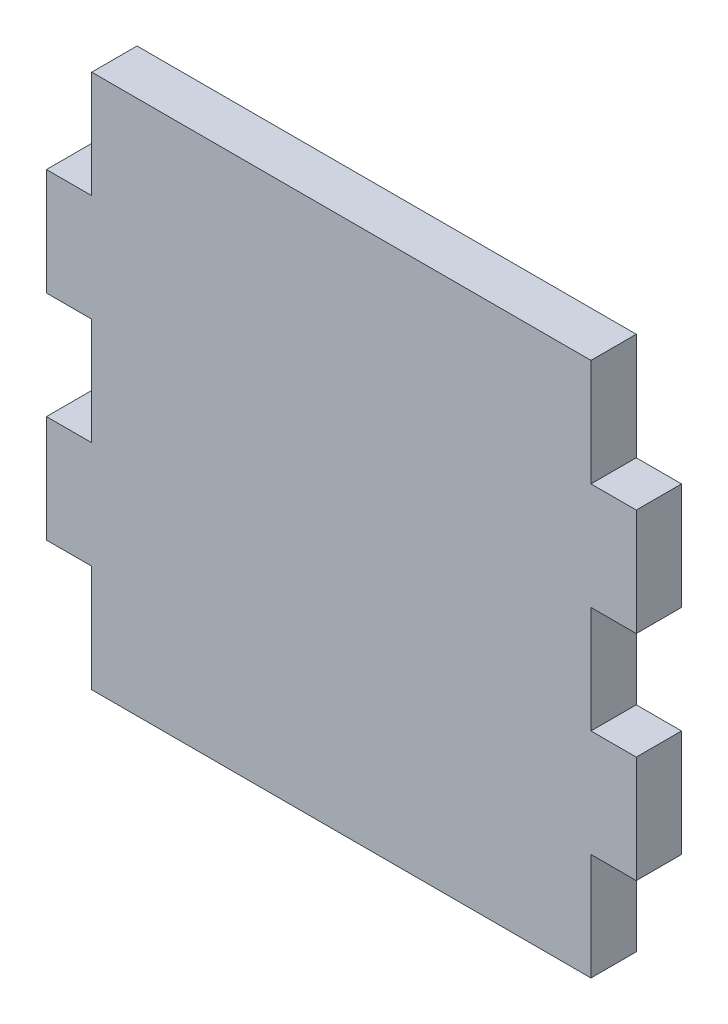
ISO-10303-21;
HEADER;
FILE_DESCRIPTION(('STEP AP214'),'2;1');
FILE_NAME('part.step','',(''),(''),'','','');
FILE_SCHEMA(('AUTOMOTIVE_DESIGN { 1 0 10303 214 1 1 1 1 }'));
ENDSEC;
DATA;
#1=APPLICATION_CONTEXT('core data for automotive mechanical design processes');
#2=APPLICATION_PROTOCOL_DEFINITION('international standard','automotive_design',2000,#1);
#3=PRODUCT_CONTEXT('',#1,'mechanical');
#4=PRODUCT('Part','Part','',(#3));
#5=PRODUCT_RELATED_PRODUCT_CATEGORY('part','',(#4));
#6=PRODUCT_DEFINITION_FORMATION('','',#4);
#7=PRODUCT_DEFINITION_CONTEXT('part definition',#1,'design');
#8=PRODUCT_DEFINITION('design','',#6,#7);
#9=PRODUCT_DEFINITION_SHAPE('','',#8);
#10=(LENGTH_UNIT() NAMED_UNIT(*) SI_UNIT(.MILLI.,.METRE.));
#11=(NAMED_UNIT(*) PLANE_ANGLE_UNIT() SI_UNIT($,.RADIAN.));
#12=(NAMED_UNIT(*) SI_UNIT($,.STERADIAN.) SOLID_ANGLE_UNIT());
#13=UNCERTAINTY_MEASURE_WITH_UNIT(LENGTH_MEASURE(1.E-05),#10,'distance_accuracy_value','');
#14=(GEOMETRIC_REPRESENTATION_CONTEXT(3) GLOBAL_UNCERTAINTY_ASSIGNED_CONTEXT((#13)) GLOBAL_UNIT_ASSIGNED_CONTEXT((#10,
#11,#12)) REPRESENTATION_CONTEXT('',''));
#15=CARTESIAN_POINT('',(0.,0.,0.));
#16=DIRECTION('',(0.,0.,1.));
#17=DIRECTION('',(1.,0.,0.));
#18=AXIS2_PLACEMENT_3D('',#15,#16,#17);
#19=CARTESIAN_POINT('',(0.,15.,6.35));
#20=DIRECTION('',(-1.,0.,0.));
#21=DIRECTION('',(0.,0.,1.));
#22=AXIS2_PLACEMENT_3D('',#19,#20,#21);
#23=PLANE('',#22);
#24=DIRECTION('',(0.,1.,0.));
#25=VECTOR('',#24,1.);
#26=CARTESIAN_POINT('',(0.,15.,0.));
#27=LINE('',#26,#25);
#28=CARTESIAN_POINT('',(0.,0.,0.));
#29=VERTEX_POINT('',#28);
#30=CARTESIAN_POINT('',(0.,15.,0.));
#31=VERTEX_POINT('',#30);
#32=EDGE_CURVE('E199',#29,#31,#27,.T.);
#33=ORIENTED_EDGE('',*,*,#32,.T.);
#34=DIRECTION('',(0.,0.,-1.));
#35=VECTOR('',#34,1.);
#36=CARTESIAN_POINT('',(0.,15.,6.35));
#37=LINE('',#36,#35);
#38=CARTESIAN_POINT('',(0.,15.,6.35));
#39=VERTEX_POINT('',#38);
#40=EDGE_CURVE('E11',#39,#31,#37,.T.);
#41=ORIENTED_EDGE('',*,*,#40,.F.);
#42=DIRECTION('',(0.,1.,0.));
#43=VECTOR('',#42,1.);
#44=CARTESIAN_POINT('',(0.,15.,6.35));
#45=LINE('',#44,#43);
#46=CARTESIAN_POINT('',(0.,0.,6.35));
#47=VERTEX_POINT('',#46);
#48=EDGE_CURVE('E237',#47,#39,#45,.T.);
#49=ORIENTED_EDGE('',*,*,#48,.F.);
#50=DIRECTION('',(0.,0.,-1.));
#51=VECTOR('',#50,1.);
#52=CARTESIAN_POINT('',(0.,0.,6.35));
#53=LINE('',#52,#51);
#54=EDGE_CURVE('E195',#47,#29,#53,.T.);
#55=ORIENTED_EDGE('',*,*,#54,.T.);
#56=EDGE_LOOP('',(#33,#41,#49,#55));
#57=FACE_BOUND('',#56,.T.);
#58=ADVANCED_FACE('F31',(#57),#23,.F.);
#59=CARTESIAN_POINT('',(6.34999999999999,15.,6.35));
#60=DIRECTION('',(0.,1.,0.));
#61=DIRECTION('',(0.,0.,1.));
#62=AXIS2_PLACEMENT_3D('',#59,#60,#61);
#63=PLANE('',#62);
#64=DIRECTION('',(1.,0.,0.));
#65=VECTOR('',#64,1.);
#66=CARTESIAN_POINT('',(6.34999999999999,15.,0.));
#67=LINE('',#66,#65);
#68=CARTESIAN_POINT('',(6.34999999999999,15.,0.));
#69=VERTEX_POINT('',#68);
#70=EDGE_CURVE('E202',#31,#69,#67,.T.);
#71=ORIENTED_EDGE('',*,*,#70,.T.);
#72=DIRECTION('',(0.,0.,-1.));
#73=VECTOR('',#72,1.);
#74=CARTESIAN_POINT('',(6.34999999999999,15.,6.35));
#75=LINE('',#74,#73);
#76=CARTESIAN_POINT('',(6.34999999999999,15.,6.35));
#77=VERTEX_POINT('',#76);
#78=EDGE_CURVE('E39',#77,#69,#75,.T.);
#79=ORIENTED_EDGE('',*,*,#78,.F.);
#80=DIRECTION('',(1.,0.,0.));
#81=VECTOR('',#80,1.);
#82=CARTESIAN_POINT('',(6.34999999999999,15.,6.35));
#83=LINE('',#82,#81);
#84=EDGE_CURVE('E126',#39,#77,#83,.T.);
#85=ORIENTED_EDGE('',*,*,#84,.F.);
#86=ORIENTED_EDGE('',*,*,#40,.T.);
#87=EDGE_LOOP('',(#71,#79,#85,#86));
#88=FACE_BOUND('',#87,.T.);
#89=ADVANCED_FACE('F355',(#88),#63,.F.);
#90=CARTESIAN_POINT('',(6.34999999999999,30.,6.35));
#91=DIRECTION('',(-1.,0.,0.));
#92=DIRECTION('',(0.,0.,1.));
#93=AXIS2_PLACEMENT_3D('',#90,#91,#92);
#94=PLANE('',#93);
#95=DIRECTION('',(0.,1.,0.));
#96=VECTOR('',#95,1.);
#97=CARTESIAN_POINT('',(6.34999999999999,30.,0.));
#98=LINE('',#97,#96);
#99=CARTESIAN_POINT('',(6.34999999999999,30.,0.));
#100=VERTEX_POINT('',#99);
#101=EDGE_CURVE('E204',#69,#100,#98,.T.);
#102=ORIENTED_EDGE('',*,*,#101,.T.);
#103=DIRECTION('',(0.,0.,-1.));
#104=VECTOR('',#103,1.);
#105=CARTESIAN_POINT('',(6.34999999999999,30.,6.35));
#106=LINE('',#105,#104);
#107=CARTESIAN_POINT('',(6.34999999999999,30.,6.35));
#108=VERTEX_POINT('',#107);
#109=EDGE_CURVE('E280',#108,#100,#106,.T.);
#110=ORIENTED_EDGE('',*,*,#109,.F.);
#111=DIRECTION('',(0.,1.,0.));
#112=VECTOR('',#111,1.);
#113=CARTESIAN_POINT('',(6.34999999999999,30.,6.35));
#114=LINE('',#113,#112);
#115=EDGE_CURVE('E288',#77,#108,#114,.T.);
#116=ORIENTED_EDGE('',*,*,#115,.F.);
#117=ORIENTED_EDGE('',*,*,#78,.T.);
#118=EDGE_LOOP('',(#102,#110,#116,#117));
#119=FACE_BOUND('',#118,.T.);
#120=ADVANCED_FACE('F286',(#119),#94,.F.);
#121=CARTESIAN_POINT('',(0.,30.,6.35));
#122=DIRECTION('',(0.,-1.,0.));
#123=DIRECTION('',(0.,0.,-1.));
#124=AXIS2_PLACEMENT_3D('',#121,#122,#123);
#125=PLANE('',#124);
#126=DIRECTION('',(-1.,0.,0.));
#127=VECTOR('',#126,1.);
#128=CARTESIAN_POINT('',(0.,30.,0.));
#129=LINE('',#128,#127);
#130=CARTESIAN_POINT('',(0.,30.,0.));
#131=VERTEX_POINT('',#130);
#132=EDGE_CURVE('E206',#100,#131,#129,.T.);
#133=ORIENTED_EDGE('',*,*,#132,.T.);
#134=DIRECTION('',(0.,0.,-1.));
#135=VECTOR('',#134,1.);
#136=CARTESIAN_POINT('',(0.,30.,6.35));
#137=LINE('',#136,#135);
#138=CARTESIAN_POINT('',(0.,30.,6.35));
#139=VERTEX_POINT('',#138);
#140=EDGE_CURVE('E277',#139,#131,#137,.T.);
#141=ORIENTED_EDGE('',*,*,#140,.F.);
#142=DIRECTION('',(-1.,0.,0.));
#143=VECTOR('',#142,1.);
#144=CARTESIAN_POINT('',(0.,30.,6.35));
#145=LINE('',#144,#143);
#146=EDGE_CURVE('E306',#108,#139,#145,.T.);
#147=ORIENTED_EDGE('',*,*,#146,.F.);
#148=ORIENTED_EDGE('',*,*,#109,.T.);
#149=EDGE_LOOP('',(#133,#141,#147,#148));
#150=FACE_BOUND('',#149,.T.);
#151=ADVANCED_FACE('F297',(#150),#125,.F.);
#152=CARTESIAN_POINT('',(0.,45.,6.35));
#153=DIRECTION('',(-1.,0.,0.));
#154=DIRECTION('',(0.,0.,1.));
#155=AXIS2_PLACEMENT_3D('',#152,#153,#154);
#156=PLANE('',#155);
#157=DIRECTION('',(0.,1.,0.));
#158=VECTOR('',#157,1.);
#159=CARTESIAN_POINT('',(0.,45.,0.));
#160=LINE('',#159,#158);
#161=CARTESIAN_POINT('',(0.,45.,0.));
#162=VERTEX_POINT('',#161);
#163=EDGE_CURVE('E208',#131,#162,#160,.T.);
#164=ORIENTED_EDGE('',*,*,#163,.T.);
#165=DIRECTION('',(0.,0.,-1.));
#166=VECTOR('',#165,1.);
#167=CARTESIAN_POINT('',(0.,45.,6.35));
#168=LINE('',#167,#166);
#169=CARTESIAN_POINT('',(0.,45.,6.35));
#170=VERTEX_POINT('',#169);
#171=EDGE_CURVE('E274',#170,#162,#168,.T.);
#172=ORIENTED_EDGE('',*,*,#171,.F.);
#173=DIRECTION('',(0.,1.,0.));
#174=VECTOR('',#173,1.);
#175=CARTESIAN_POINT('',(0.,45.,6.35));
#176=LINE('',#175,#174);
#177=EDGE_CURVE('E303',#139,#170,#176,.T.);
#178=ORIENTED_EDGE('',*,*,#177,.F.);
#179=ORIENTED_EDGE('',*,*,#140,.T.);
#180=EDGE_LOOP('',(#164,#172,#178,#179));
#181=FACE_BOUND('',#180,.T.);
#182=ADVANCED_FACE('F301',(#181),#156,.F.);
#183=CARTESIAN_POINT('',(6.34999999999999,45.,6.35));
#184=DIRECTION('',(0.,1.,0.));
#185=DIRECTION('',(0.,0.,1.));
#186=AXIS2_PLACEMENT_3D('',#183,#184,#185);
#187=PLANE('',#186);
#188=DIRECTION('',(1.,0.,0.));
#189=VECTOR('',#188,1.);
#190=CARTESIAN_POINT('',(6.34999999999999,45.,0.));
#191=LINE('',#190,#189);
#192=CARTESIAN_POINT('',(6.34999999999999,45.,0.));
#193=VERTEX_POINT('',#192);
#194=EDGE_CURVE('E210',#162,#193,#191,.T.);
#195=ORIENTED_EDGE('',*,*,#194,.T.);
#196=DIRECTION('',(0.,0.,-1.));
#197=VECTOR('',#196,1.);
#198=CARTESIAN_POINT('',(6.34999999999999,45.,6.35));
#199=LINE('',#198,#197);
#200=CARTESIAN_POINT('',(6.34999999999999,45.,6.35));
#201=VERTEX_POINT('',#200);
#202=EDGE_CURVE('E271',#201,#193,#199,.T.);
#203=ORIENTED_EDGE('',*,*,#202,.F.);
#204=DIRECTION('',(1.,0.,0.));
#205=VECTOR('',#204,1.);
#206=CARTESIAN_POINT('',(6.34999999999999,45.,6.35));
#207=LINE('',#206,#205);
#208=EDGE_CURVE('E305',#170,#201,#207,.T.);
#209=ORIENTED_EDGE('',*,*,#208,.F.);
#210=ORIENTED_EDGE('',*,*,#171,.T.);
#211=EDGE_LOOP('',(#195,#203,#209,#210));
#212=FACE_BOUND('',#211,.T.);
#213=ADVANCED_FACE('F368',(#212),#187,.F.);
#214=CARTESIAN_POINT('',(6.35000000000001,60.,6.35));
#215=DIRECTION('',(-1.,0.,0.));
#216=DIRECTION('',(0.,-1.,0.));
#217=AXIS2_PLACEMENT_3D('',#214,#215,#216);
#218=PLANE('',#217);
#219=DIRECTION('',(0.,1.,0.));
#220=VECTOR('',#219,1.);
#221=CARTESIAN_POINT('',(6.35000000000001,60.,0.));
#222=LINE('',#221,#220);
#223=CARTESIAN_POINT('',(6.35000000000001,60.,0.));
#224=VERTEX_POINT('',#223);
#225=EDGE_CURVE('E212',#193,#224,#222,.T.);
#226=ORIENTED_EDGE('',*,*,#225,.T.);
#227=DIRECTION('',(0.,0.,-1.));
#228=VECTOR('',#227,1.);
#229=CARTESIAN_POINT('',(6.35000000000001,60.,6.35));
#230=LINE('',#229,#228);
#231=CARTESIAN_POINT('',(6.35000000000001,60.,6.35));
#232=VERTEX_POINT('',#231);
#233=EDGE_CURVE('E268',#232,#224,#230,.T.);
#234=ORIENTED_EDGE('',*,*,#233,.F.);
#235=DIRECTION('',(0.,1.,0.));
#236=VECTOR('',#235,1.);
#237=CARTESIAN_POINT('',(6.35000000000001,60.,6.35));
#238=LINE('',#237,#236);
#239=EDGE_CURVE('E308',#201,#232,#238,.T.);
#240=ORIENTED_EDGE('',*,*,#239,.F.);
#241=ORIENTED_EDGE('',*,*,#202,.T.);
#242=EDGE_LOOP('',(#226,#234,#240,#241));
#243=FACE_BOUND('',#242,.T.);
#244=ADVANCED_FACE('F371',(#243),#218,.F.);
#245=CARTESIAN_POINT('',(0.,60.,6.35));
#246=DIRECTION('',(0.,-1.,0.));
#247=DIRECTION('',(0.,0.,-1.));
#248=AXIS2_PLACEMENT_3D('',#245,#246,#247);
#249=PLANE('',#248);
#250=DIRECTION('',(-1.,0.,0.));
#251=VECTOR('',#250,1.);
#252=CARTESIAN_POINT('',(0.,60.,0.));
#253=LINE('',#252,#251);
#254=CARTESIAN_POINT('',(0.,60.,0.));
#255=VERTEX_POINT('',#254);
#256=EDGE_CURVE('E214',#224,#255,#253,.T.);
#257=ORIENTED_EDGE('',*,*,#256,.T.);
#258=DIRECTION('',(0.,0.,-1.));
#259=VECTOR('',#258,1.);
#260=CARTESIAN_POINT('',(0.,60.,6.35));
#261=LINE('',#260,#259);
#262=CARTESIAN_POINT('',(0.,60.,6.35));
#263=VERTEX_POINT('',#262);
#264=EDGE_CURVE('E265',#263,#255,#261,.T.);
#265=ORIENTED_EDGE('',*,*,#264,.F.);
#266=DIRECTION('',(-1.,0.,0.));
#267=VECTOR('',#266,1.);
#268=CARTESIAN_POINT('',(0.,60.,6.35));
#269=LINE('',#268,#267);
#270=EDGE_CURVE('E314',#232,#263,#269,.T.);
#271=ORIENTED_EDGE('',*,*,#270,.F.);
#272=ORIENTED_EDGE('',*,*,#233,.T.);
#273=EDGE_LOOP('',(#257,#265,#271,#272));
#274=FACE_BOUND('',#273,.T.);
#275=ADVANCED_FACE('F375',(#274),#249,.F.);
#276=CARTESIAN_POINT('',(0.,75.,6.35));
#277=DIRECTION('',(-1.,0.,0.));
#278=DIRECTION('',(0.,0.,1.));
#279=AXIS2_PLACEMENT_3D('',#276,#277,#278);
#280=PLANE('',#279);
#281=DIRECTION('',(0.,1.,0.));
#282=VECTOR('',#281,1.);
#283=CARTESIAN_POINT('',(0.,75.,0.));
#284=LINE('',#283,#282);
#285=CARTESIAN_POINT('',(0.,75.,0.));
#286=VERTEX_POINT('',#285);
#287=EDGE_CURVE('E216',#255,#286,#284,.T.);
#288=ORIENTED_EDGE('',*,*,#287,.T.);
#289=DIRECTION('',(0.,0.,-1.));
#290=VECTOR('',#289,1.);
#291=CARTESIAN_POINT('',(0.,75.,6.35));
#292=LINE('',#291,#290);
#293=CARTESIAN_POINT('',(0.,75.,6.35));
#294=VERTEX_POINT('',#293);
#295=EDGE_CURVE('E262',#294,#286,#292,.T.);
#296=ORIENTED_EDGE('',*,*,#295,.F.);
#297=DIRECTION('',(0.,1.,0.));
#298=VECTOR('',#297,1.);
#299=CARTESIAN_POINT('',(0.,75.,6.35));
#300=LINE('',#299,#298);
#301=EDGE_CURVE('E316',#263,#294,#300,.T.);
#302=ORIENTED_EDGE('',*,*,#301,.F.);
#303=ORIENTED_EDGE('',*,*,#264,.T.);
#304=EDGE_LOOP('',(#288,#296,#302,#303));
#305=FACE_BOUND('',#304,.T.);
#306=ADVANCED_FACE('F379',(#305),#280,.F.);
#307=CARTESIAN_POINT('',(0.,75.,6.35));
#308=DIRECTION('',(0.,-1.,0.));
#309=DIRECTION('',(0.,0.,-1.));
#310=AXIS2_PLACEMENT_3D('',#307,#308,#309);
#311=PLANE('',#310);
#312=DIRECTION('',(-1.,0.,0.));
#313=VECTOR('',#312,1.);
#314=CARTESIAN_POINT('',(0.,75.,0.));
#315=LINE('',#314,#313);
#316=CARTESIAN_POINT('',(-70.,75.,0.));
#317=VERTEX_POINT('',#316);
#318=EDGE_CURVE('E218',#286,#317,#315,.T.);
#319=ORIENTED_EDGE('',*,*,#318,.T.);
#320=DIRECTION('',(0.,0.,-1.));
#321=VECTOR('',#320,1.);
#322=CARTESIAN_POINT('',(-70.,75.,6.35));
#323=LINE('',#322,#321);
#324=CARTESIAN_POINT('',(-70.,75.,6.35));
#325=VERTEX_POINT('',#324);
#326=EDGE_CURVE('E259',#325,#317,#323,.T.);
#327=ORIENTED_EDGE('',*,*,#326,.F.);
#328=DIRECTION('',(-1.,0.,0.));
#329=VECTOR('',#328,1.);
#330=CARTESIAN_POINT('',(0.,75.,6.35));
#331=LINE('',#330,#329);
#332=EDGE_CURVE('E318',#294,#325,#331,.T.);
#333=ORIENTED_EDGE('',*,*,#332,.F.);
#334=ORIENTED_EDGE('',*,*,#295,.T.);
#335=EDGE_LOOP('',(#319,#327,#333,#334));
#336=FACE_BOUND('',#335,.T.);
#337=ADVANCED_FACE('F383',(#336),#311,.F.);
#338=CARTESIAN_POINT('',(-70.,75.,6.35));
#339=DIRECTION('',(1.,0.,0.));
#340=DIRECTION('',(0.,0.,-1.));
#341=AXIS2_PLACEMENT_3D('',#338,#339,#340);
#342=PLANE('',#341);
#343=DIRECTION('',(0.,-1.,0.));
#344=VECTOR('',#343,1.);
#345=CARTESIAN_POINT('',(-70.,75.,0.));
#346=LINE('',#345,#344);
#347=CARTESIAN_POINT('',(-70.,60.,0.));
#348=VERTEX_POINT('',#347);
#349=EDGE_CURVE('E220',#317,#348,#346,.T.);
#350=ORIENTED_EDGE('',*,*,#349,.T.);
#351=DIRECTION('',(0.,0.,-1.));
#352=VECTOR('',#351,1.);
#353=CARTESIAN_POINT('',(-70.,60.,6.35));
#354=LINE('',#353,#352);
#355=CARTESIAN_POINT('',(-70.,60.,6.35));
#356=VERTEX_POINT('',#355);
#357=EDGE_CURVE('E256',#356,#348,#354,.T.);
#358=ORIENTED_EDGE('',*,*,#357,.F.);
#359=DIRECTION('',(0.,-1.,0.));
#360=VECTOR('',#359,1.);
#361=CARTESIAN_POINT('',(-70.,75.,6.35));
#362=LINE('',#361,#360);
#363=EDGE_CURVE('E320',#325,#356,#362,.T.);
#364=ORIENTED_EDGE('',*,*,#363,.F.);
#365=ORIENTED_EDGE('',*,*,#326,.T.);
#366=EDGE_LOOP('',(#350,#358,#364,#365));
#367=FACE_BOUND('',#366,.T.);
#368=ADVANCED_FACE('F387',(#367),#342,.F.);
#369=CARTESIAN_POINT('',(-70.,60.,6.35));
#370=DIRECTION('',(0.,-1.,0.));
#371=DIRECTION('',(0.,0.,-1.));
#372=AXIS2_PLACEMENT_3D('',#369,#370,#371);
#373=PLANE('',#372);
#374=DIRECTION('',(-1.,0.,0.));
#375=VECTOR('',#374,1.);
#376=CARTESIAN_POINT('',(-70.,60.,0.));
#377=LINE('',#376,#375);
#378=CARTESIAN_POINT('',(-76.35,60.,0.));
#379=VERTEX_POINT('',#378);
#380=EDGE_CURVE('E222',#348,#379,#377,.T.);
#381=ORIENTED_EDGE('',*,*,#380,.T.);
#382=DIRECTION('',(0.,0.,-1.));
#383=VECTOR('',#382,1.);
#384=CARTESIAN_POINT('',(-76.35,60.,6.35));
#385=LINE('',#384,#383);
#386=CARTESIAN_POINT('',(-76.35,60.,6.35));
#387=VERTEX_POINT('',#386);
#388=EDGE_CURVE('E253',#387,#379,#385,.T.);
#389=ORIENTED_EDGE('',*,*,#388,.F.);
#390=DIRECTION('',(-1.,0.,0.));
#391=VECTOR('',#390,1.);
#392=CARTESIAN_POINT('',(-70.,60.,6.35));
#393=LINE('',#392,#391);
#394=EDGE_CURVE('E322',#356,#387,#393,.T.);
#395=ORIENTED_EDGE('',*,*,#394,.F.);
#396=ORIENTED_EDGE('',*,*,#357,.T.);
#397=EDGE_LOOP('',(#381,#389,#395,#396));
#398=FACE_BOUND('',#397,.T.);
#399=ADVANCED_FACE('F391',(#398),#373,.F.);
#400=CARTESIAN_POINT('',(-76.35,60.,6.35));
#401=DIRECTION('',(1.,0.,0.));
#402=DIRECTION('',(0.,0.,-1.));
#403=AXIS2_PLACEMENT_3D('',#400,#401,#402);
#404=PLANE('',#403);
#405=DIRECTION('',(0.,-1.,0.));
#406=VECTOR('',#405,1.);
#407=CARTESIAN_POINT('',(-76.35,60.,0.));
#408=LINE('',#407,#406);
#409=CARTESIAN_POINT('',(-76.35,45.,0.));
#410=VERTEX_POINT('',#409);
#411=EDGE_CURVE('E224',#379,#410,#408,.T.);
#412=ORIENTED_EDGE('',*,*,#411,.T.);
#413=DIRECTION('',(0.,0.,-1.));
#414=VECTOR('',#413,1.);
#415=CARTESIAN_POINT('',(-76.35,45.,6.35));
#416=LINE('',#415,#414);
#417=CARTESIAN_POINT('',(-76.35,45.,6.35));
#418=VERTEX_POINT('',#417);
#419=EDGE_CURVE('E250',#418,#410,#416,.T.);
#420=ORIENTED_EDGE('',*,*,#419,.F.);
#421=DIRECTION('',(0.,-1.,0.));
#422=VECTOR('',#421,1.);
#423=CARTESIAN_POINT('',(-76.35,60.,6.35));
#424=LINE('',#423,#422);
#425=EDGE_CURVE('E324',#387,#418,#424,.T.);
#426=ORIENTED_EDGE('',*,*,#425,.F.);
#427=ORIENTED_EDGE('',*,*,#388,.T.);
#428=EDGE_LOOP('',(#412,#420,#426,#427));
#429=FACE_BOUND('',#428,.T.);
#430=ADVANCED_FACE('F395',(#429),#404,.F.);
#431=CARTESIAN_POINT('',(-76.35,45.,6.35));
#432=DIRECTION('',(0.,1.,0.));
#433=DIRECTION('',(0.,0.,1.));
#434=AXIS2_PLACEMENT_3D('',#431,#432,#433);
#435=PLANE('',#434);
#436=DIRECTION('',(1.,0.,0.));
#437=VECTOR('',#436,1.);
#438=CARTESIAN_POINT('',(-76.35,45.,0.));
#439=LINE('',#438,#437);
#440=CARTESIAN_POINT('',(-70.,45.,0.));
#441=VERTEX_POINT('',#440);
#442=EDGE_CURVE('E226',#410,#441,#439,.T.);
#443=ORIENTED_EDGE('',*,*,#442,.T.);
#444=DIRECTION('',(0.,0.,-1.));
#445=VECTOR('',#444,1.);
#446=CARTESIAN_POINT('',(-70.,45.,6.35));
#447=LINE('',#446,#445);
#448=CARTESIAN_POINT('',(-70.,45.,6.35));
#449=VERTEX_POINT('',#448);
#450=EDGE_CURVE('E247',#449,#441,#447,.T.);
#451=ORIENTED_EDGE('',*,*,#450,.F.);
#452=DIRECTION('',(1.,0.,0.));
#453=VECTOR('',#452,1.);
#454=CARTESIAN_POINT('',(-76.35,45.,6.35));
#455=LINE('',#454,#453);
#456=EDGE_CURVE('E326',#418,#449,#455,.T.);
#457=ORIENTED_EDGE('',*,*,#456,.F.);
#458=ORIENTED_EDGE('',*,*,#419,.T.);
#459=EDGE_LOOP('',(#443,#451,#457,#458));
#460=FACE_BOUND('',#459,.T.);
#461=ADVANCED_FACE('F399',(#460),#435,.F.);
#462=CARTESIAN_POINT('',(-70.,45.,6.35));
#463=DIRECTION('',(1.,0.,0.));
#464=DIRECTION('',(0.,0.,-1.));
#465=AXIS2_PLACEMENT_3D('',#462,#463,#464);
#466=PLANE('',#465);
#467=DIRECTION('',(0.,-1.,0.));
#468=VECTOR('',#467,1.);
#469=CARTESIAN_POINT('',(-70.,45.,0.));
#470=LINE('',#469,#468);
#471=CARTESIAN_POINT('',(-70.,30.,0.));
#472=VERTEX_POINT('',#471);
#473=EDGE_CURVE('E228',#441,#472,#470,.T.);
#474=ORIENTED_EDGE('',*,*,#473,.T.);
#475=DIRECTION('',(0.,0.,-1.));
#476=VECTOR('',#475,1.);
#477=CARTESIAN_POINT('',(-70.,30.,6.35));
#478=LINE('',#477,#476);
#479=CARTESIAN_POINT('',(-70.,30.,6.35));
#480=VERTEX_POINT('',#479);
#481=EDGE_CURVE('E244',#480,#472,#478,.T.);
#482=ORIENTED_EDGE('',*,*,#481,.F.);
#483=DIRECTION('',(0.,-1.,0.));
#484=VECTOR('',#483,1.);
#485=CARTESIAN_POINT('',(-70.,45.,6.35));
#486=LINE('',#485,#484);
#487=EDGE_CURVE('E328',#449,#480,#486,.T.);
#488=ORIENTED_EDGE('',*,*,#487,.F.);
#489=ORIENTED_EDGE('',*,*,#450,.T.);
#490=EDGE_LOOP('',(#474,#482,#488,#489));
#491=FACE_BOUND('',#490,.T.);
#492=ADVANCED_FACE('F403',(#491),#466,.F.);
#493=CARTESIAN_POINT('',(-70.,30.,6.35));
#494=DIRECTION('',(0.,-1.,0.));
#495=DIRECTION('',(0.,0.,-1.));
#496=AXIS2_PLACEMENT_3D('',#493,#494,#495);
#497=PLANE('',#496);
#498=DIRECTION('',(-1.,0.,0.));
#499=VECTOR('',#498,1.);
#500=CARTESIAN_POINT('',(-70.,30.,0.));
#501=LINE('',#500,#499);
#502=CARTESIAN_POINT('',(-76.35,30.,0.));
#503=VERTEX_POINT('',#502);
#504=EDGE_CURVE('E230',#472,#503,#501,.T.);
#505=ORIENTED_EDGE('',*,*,#504,.T.);
#506=DIRECTION('',(0.,0.,-1.));
#507=VECTOR('',#506,1.);
#508=CARTESIAN_POINT('',(-76.35,30.,6.35));
#509=LINE('',#508,#507);
#510=CARTESIAN_POINT('',(-76.35,30.,6.35));
#511=VERTEX_POINT('',#510);
#512=EDGE_CURVE('E241',#511,#503,#509,.T.);
#513=ORIENTED_EDGE('',*,*,#512,.F.);
#514=DIRECTION('',(-1.,0.,0.));
#515=VECTOR('',#514,1.);
#516=CARTESIAN_POINT('',(-70.,30.,6.35));
#517=LINE('',#516,#515);
#518=EDGE_CURVE('E330',#480,#511,#517,.T.);
#519=ORIENTED_EDGE('',*,*,#518,.F.);
#520=ORIENTED_EDGE('',*,*,#481,.T.);
#521=EDGE_LOOP('',(#505,#513,#519,#520));
#522=FACE_BOUND('',#521,.T.);
#523=ADVANCED_FACE('F336',(#522),#497,.F.);
#524=CARTESIAN_POINT('',(-76.35,30.,6.35));
#525=DIRECTION('',(1.,0.,0.));
#526=DIRECTION('',(0.,0.,-1.));
#527=AXIS2_PLACEMENT_3D('',#524,#525,#526);
#528=PLANE('',#527);
#529=DIRECTION('',(0.,-1.,0.));
#530=VECTOR('',#529,1.);
#531=CARTESIAN_POINT('',(-76.35,30.,0.));
#532=LINE('',#531,#530);
#533=CARTESIAN_POINT('',(-76.35,15.,0.));
#534=VERTEX_POINT('',#533);
#535=EDGE_CURVE('E232',#503,#534,#532,.T.);
#536=ORIENTED_EDGE('',*,*,#535,.T.);
#537=DIRECTION('',(0.,0.,-1.));
#538=VECTOR('',#537,1.);
#539=CARTESIAN_POINT('',(-76.35,15.,6.35));
#540=LINE('',#539,#538);
#541=CARTESIAN_POINT('',(-76.35,15.,6.35));
#542=VERTEX_POINT('',#541);
#543=EDGE_CURVE('E190',#542,#534,#540,.T.);
#544=ORIENTED_EDGE('',*,*,#543,.F.);
#545=DIRECTION('',(0.,-1.,0.));
#546=VECTOR('',#545,1.);
#547=CARTESIAN_POINT('',(-76.35,30.,6.35));
#548=LINE('',#547,#546);
#549=EDGE_CURVE('E181',#511,#542,#548,.T.);
#550=ORIENTED_EDGE('',*,*,#549,.F.);
#551=ORIENTED_EDGE('',*,*,#512,.T.);
#552=EDGE_LOOP('',(#536,#544,#550,#551));
#553=FACE_BOUND('',#552,.T.);
#554=ADVANCED_FACE('F340',(#553),#528,.F.);
#555=CARTESIAN_POINT('',(-76.35,15.,6.35));
#556=DIRECTION('',(0.,1.,0.));
#557=DIRECTION('',(0.,0.,1.));
#558=AXIS2_PLACEMENT_3D('',#555,#556,#557);
#559=PLANE('',#558);
#560=DIRECTION('',(1.,0.,0.));
#561=VECTOR('',#560,1.);
#562=CARTESIAN_POINT('',(-76.35,15.,0.));
#563=LINE('',#562,#561);
#564=CARTESIAN_POINT('',(-70.,15.,0.));
#565=VERTEX_POINT('',#564);
#566=EDGE_CURVE('E189',#534,#565,#563,.T.);
#567=ORIENTED_EDGE('',*,*,#566,.T.);
#568=DIRECTION('',(0.,0.,-1.));
#569=VECTOR('',#568,1.);
#570=CARTESIAN_POINT('',(-70.,15.,6.35));
#571=LINE('',#570,#569);
#572=CARTESIAN_POINT('',(-70.,15.,6.35));
#573=VERTEX_POINT('',#572);
#574=EDGE_CURVE('E186',#573,#565,#571,.T.);
#575=ORIENTED_EDGE('',*,*,#574,.F.);
#576=DIRECTION('',(1.,0.,0.));
#577=VECTOR('',#576,1.);
#578=CARTESIAN_POINT('',(-76.35,15.,6.35));
#579=LINE('',#578,#577);
#580=EDGE_CURVE('E175',#542,#573,#579,.T.);
#581=ORIENTED_EDGE('',*,*,#580,.F.);
#582=ORIENTED_EDGE('',*,*,#543,.T.);
#583=EDGE_LOOP('',(#567,#575,#581,#582));
#584=FACE_BOUND('',#583,.T.);
#585=ADVANCED_FACE('F187',(#584),#559,.F.);
#586=CARTESIAN_POINT('',(-70.,15.,6.35));
#587=DIRECTION('',(1.,0.,0.));
#588=DIRECTION('',(0.,0.,-1.));
#589=AXIS2_PLACEMENT_3D('',#586,#587,#588);
#590=PLANE('',#589);
#591=DIRECTION('',(0.,-1.,0.));
#592=VECTOR('',#591,1.);
#593=CARTESIAN_POINT('',(-70.,15.,0.));
#594=LINE('',#593,#592);
#595=CARTESIAN_POINT('',(-70.,0.,0.));
#596=VERTEX_POINT('',#595);
#597=EDGE_CURVE('E112',#565,#596,#594,.T.);
#598=ORIENTED_EDGE('',*,*,#597,.T.);
#599=DIRECTION('',(0.,0.,-1.));
#600=VECTOR('',#599,1.);
#601=CARTESIAN_POINT('',(-70.,0.,6.35));
#602=LINE('',#601,#600);
#603=CARTESIAN_POINT('',(-70.,0.,6.35));
#604=VERTEX_POINT('',#603);
#605=EDGE_CURVE('E191',#604,#596,#602,.T.);
#606=ORIENTED_EDGE('',*,*,#605,.F.);
#607=DIRECTION('',(0.,-1.,0.));
#608=VECTOR('',#607,1.);
#609=CARTESIAN_POINT('',(-70.,15.,6.35));
#610=LINE('',#609,#608);
#611=EDGE_CURVE('E179',#573,#604,#610,.T.);
#612=ORIENTED_EDGE('',*,*,#611,.F.);
#613=ORIENTED_EDGE('',*,*,#574,.T.);
#614=EDGE_LOOP('',(#598,#606,#612,#613));
#615=FACE_BOUND('',#614,.T.);
#616=ADVANCED_FACE('F193',(#615),#590,.F.);
#617=CARTESIAN_POINT('',(0.,0.,6.35));
#618=DIRECTION('',(0.,1.,0.));
#619=DIRECTION('',(-1.,0.,0.));
#620=AXIS2_PLACEMENT_3D('',#617,#618,#619);
#621=PLANE('',#620);
#622=DIRECTION('',(1.,0.,0.));
#623=VECTOR('',#622,1.);
#624=CARTESIAN_POINT('',(0.,0.,0.));
#625=LINE('',#624,#623);
#626=EDGE_CURVE('E118',#596,#29,#625,.T.);
#627=ORIENTED_EDGE('',*,*,#626,.T.);
#628=ORIENTED_EDGE('',*,*,#54,.F.);
#629=DIRECTION('',(1.,0.,0.));
#630=VECTOR('',#629,1.);
#631=CARTESIAN_POINT('',(0.,0.,6.35));
#632=LINE('',#631,#630);
#633=EDGE_CURVE('E47',#604,#47,#632,.T.);
#634=ORIENTED_EDGE('',*,*,#633,.F.);
#635=ORIENTED_EDGE('',*,*,#605,.T.);
#636=EDGE_LOOP('',(#627,#628,#634,#635));
#637=FACE_BOUND('',#636,.T.);
#638=ADVANCED_FACE('F344',(#637),#621,.F.);
#639=CARTESIAN_POINT('',(0.,0.,6.35));
#640=DIRECTION('',(0.,0.,-1.));
#641=DIRECTION('',(-1.,0.,0.));
#642=AXIS2_PLACEMENT_3D('',#639,#640,#641);
#643=PLANE('',#642);
#644=ORIENTED_EDGE('',*,*,#48,.T.);
#645=ORIENTED_EDGE('',*,*,#84,.T.);
#646=ORIENTED_EDGE('',*,*,#115,.T.);
#647=ORIENTED_EDGE('',*,*,#146,.T.);
#648=ORIENTED_EDGE('',*,*,#177,.T.);
#649=ORIENTED_EDGE('',*,*,#208,.T.);
#650=ORIENTED_EDGE('',*,*,#239,.T.);
#651=ORIENTED_EDGE('',*,*,#270,.T.);
#652=ORIENTED_EDGE('',*,*,#301,.T.);
#653=ORIENTED_EDGE('',*,*,#332,.T.);
#654=ORIENTED_EDGE('',*,*,#363,.T.);
#655=ORIENTED_EDGE('',*,*,#394,.T.);
#656=ORIENTED_EDGE('',*,*,#425,.T.);
#657=ORIENTED_EDGE('',*,*,#456,.T.);
#658=ORIENTED_EDGE('',*,*,#487,.T.);
#659=ORIENTED_EDGE('',*,*,#518,.T.);
#660=ORIENTED_EDGE('',*,*,#549,.T.);
#661=ORIENTED_EDGE('',*,*,#580,.T.);
#662=ORIENTED_EDGE('',*,*,#611,.T.);
#663=ORIENTED_EDGE('',*,*,#633,.T.);
#664=EDGE_LOOP('',(#644,#645,#646,#647,#648,#649,#650,#651,#652,#653,#654,#655,#656,#657,#658,
#659,#660,#661,#662,#663));
#665=FACE_BOUND('',#664,.T.);
#666=ADVANCED_FACE('F177',(#665),#643,.F.);
#667=CARTESIAN_POINT('',(0.,0.,0.));
#668=DIRECTION('',(0.,0.,-1.));
#669=DIRECTION('',(-1.,0.,0.));
#670=AXIS2_PLACEMENT_3D('',#667,#668,#669);
#671=PLANE('',#670);
#672=ORIENTED_EDGE('',*,*,#32,.F.);
#673=ORIENTED_EDGE('',*,*,#626,.F.);
#674=ORIENTED_EDGE('',*,*,#597,.F.);
#675=ORIENTED_EDGE('',*,*,#566,.F.);
#676=ORIENTED_EDGE('',*,*,#535,.F.);
#677=ORIENTED_EDGE('',*,*,#504,.F.);
#678=ORIENTED_EDGE('',*,*,#473,.F.);
#679=ORIENTED_EDGE('',*,*,#442,.F.);
#680=ORIENTED_EDGE('',*,*,#411,.F.);
#681=ORIENTED_EDGE('',*,*,#380,.F.);
#682=ORIENTED_EDGE('',*,*,#349,.F.);
#683=ORIENTED_EDGE('',*,*,#318,.F.);
#684=ORIENTED_EDGE('',*,*,#287,.F.);
#685=ORIENTED_EDGE('',*,*,#256,.F.);
#686=ORIENTED_EDGE('',*,*,#225,.F.);
#687=ORIENTED_EDGE('',*,*,#194,.F.);
#688=ORIENTED_EDGE('',*,*,#163,.F.);
#689=ORIENTED_EDGE('',*,*,#132,.F.);
#690=ORIENTED_EDGE('',*,*,#101,.F.);
#691=ORIENTED_EDGE('',*,*,#70,.F.);
#692=EDGE_LOOP('',(#672,#673,#674,#675,#676,#677,#678,#679,#680,#681,#682,#683,#684,#685,#686,
#687,#688,#689,#690,#691));
#693=FACE_BOUND('',#692,.T.);
#694=ADVANCED_FACE('F292',(#693),#671,.T.);
#695=CLOSED_SHELL('',(#58,#89,#120,#151,#182,#213,#244,#275,#306,#337,#368,#399,#430,#461,#492,
#523,#554,#585,#616,#638,#666,#694));
#696=MANIFOLD_SOLID_BREP('B2',#695);
#697=ADVANCED_BREP_SHAPE_REPRESENTATION('',(#18,#696),#14);
#698=SHAPE_DEFINITION_REPRESENTATION(#9,#697);
ENDSEC;
END-ISO-10303-21;
